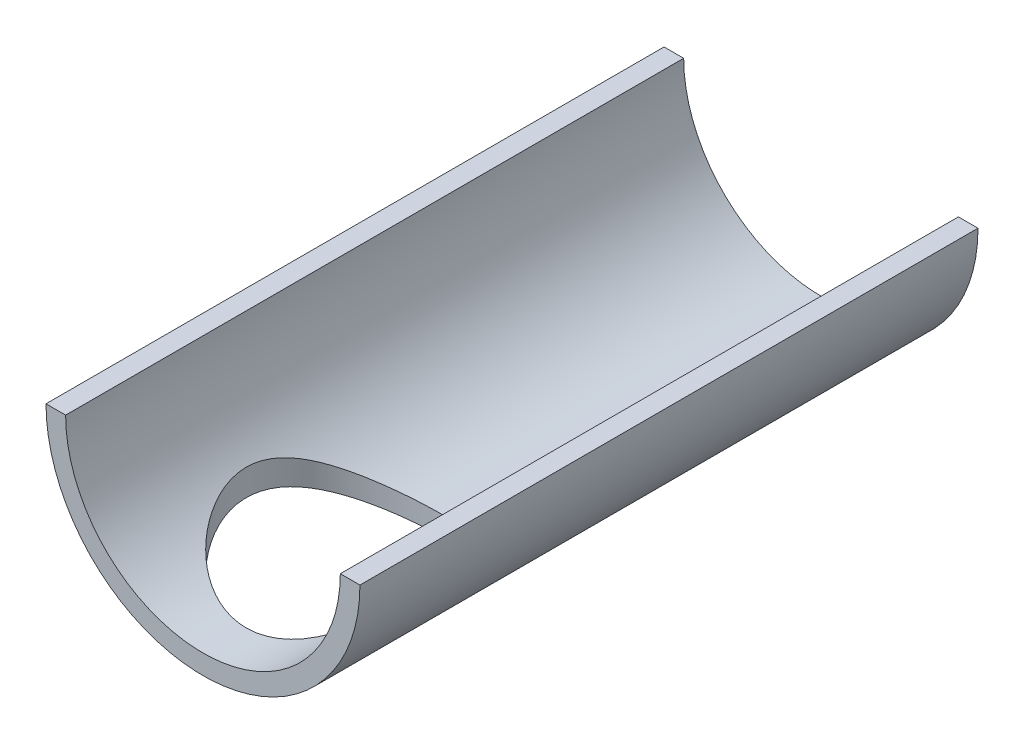
ISO-10303-21;
HEADER;
FILE_DESCRIPTION(('STEP AP214'),'2;1');
FILE_NAME('part.step','',(''),(''),'','','');
FILE_SCHEMA(('AUTOMOTIVE_DESIGN { 1 0 10303 214 1 1 1 1 }'));
ENDSEC;
DATA;
#1=APPLICATION_CONTEXT('core data for automotive mechanical design processes');
#2=APPLICATION_PROTOCOL_DEFINITION('international standard','automotive_design',2000,#1);
#3=PRODUCT_CONTEXT('',#1,'mechanical');
#4=PRODUCT('Part','Part','',(#3));
#5=PRODUCT_RELATED_PRODUCT_CATEGORY('part','',(#4));
#6=PRODUCT_DEFINITION_FORMATION('','',#4);
#7=PRODUCT_DEFINITION_CONTEXT('part definition',#1,'design');
#8=PRODUCT_DEFINITION('design','',#6,#7);
#9=PRODUCT_DEFINITION_SHAPE('','',#8);
#10=(LENGTH_UNIT() NAMED_UNIT(*) SI_UNIT(.MILLI.,.METRE.));
#11=(NAMED_UNIT(*) PLANE_ANGLE_UNIT() SI_UNIT($,.RADIAN.));
#12=(NAMED_UNIT(*) SI_UNIT($,.STERADIAN.) SOLID_ANGLE_UNIT());
#13=UNCERTAINTY_MEASURE_WITH_UNIT(LENGTH_MEASURE(1.E-05),#10,'distance_accuracy_value','');
#14=(GEOMETRIC_REPRESENTATION_CONTEXT(3) GLOBAL_UNCERTAINTY_ASSIGNED_CONTEXT((#13)) GLOBAL_UNIT_ASSIGNED_CONTEXT((#10,
#11,#12)) REPRESENTATION_CONTEXT('',''));
#15=CARTESIAN_POINT('',(0.,0.,0.));
#16=DIRECTION('',(0.,0.,1.));
#17=DIRECTION('',(1.,0.,0.));
#18=AXIS2_PLACEMENT_3D('',#15,#16,#17);
#19=CARTESIAN_POINT('',(0.,0.,0.));
#20=DIRECTION('',(0.,0.,1.));
#21=DIRECTION('',(1.,0.,0.));
#22=AXIS2_PLACEMENT_3D('',#19,#20,#21);
#23=PLANE('',#22);
#24=DIRECTION('',(1.,0.,0.));
#25=VECTOR('',#24,1.);
#26=CARTESIAN_POINT('',(-25.4,0.,0.));
#27=LINE('',#26,#25);
#28=CARTESIAN_POINT('',(22.225,0.,0.));
#29=VERTEX_POINT('',#28);
#30=CARTESIAN_POINT('',(25.4,0.,0.));
#31=VERTEX_POINT('',#30);
#32=EDGE_CURVE('E107',#29,#31,#27,.T.);
#33=ORIENTED_EDGE('',*,*,#32,.T.);
#34=CARTESIAN_POINT('',(0.,0.,0.));
#35=DIRECTION('',(0.,0.,1.));
#36=DIRECTION('',(1.,0.,0.));
#37=AXIS2_PLACEMENT_3D('',#34,#35,#36);
#38=CIRCLE('',#37,25.4);
#39=CARTESIAN_POINT('',(-25.4,0.,0.));
#40=VERTEX_POINT('',#39);
#41=EDGE_CURVE('E49',#40,#31,#38,.T.);
#42=ORIENTED_EDGE('',*,*,#41,.F.);
#43=CARTESIAN_POINT('',(-22.225,0.,0.));
#44=VERTEX_POINT('',#43);
#45=EDGE_CURVE('E108',#40,#44,#27,.T.);
#46=ORIENTED_EDGE('',*,*,#45,.T.);
#47=CARTESIAN_POINT('',(0.,0.,0.));
#48=DIRECTION('',(0.,0.,1.));
#49=DIRECTION('',(1.,0.,0.));
#50=AXIS2_PLACEMENT_3D('',#47,#48,#49);
#51=CIRCLE('',#50,22.225);
#52=EDGE_CURVE('E96',#44,#29,#51,.T.);
#53=ORIENTED_EDGE('',*,*,#52,.T.);
#54=EDGE_LOOP('',(#33,#42,#46,#53));
#55=FACE_BOUND('',#54,.T.);
#56=ADVANCED_FACE('F34',(#55),#23,.F.);
#57=CARTESIAN_POINT('',(0.,0.,914.4));
#58=DIRECTION('',(0.,0.,-1.));
#59=DIRECTION('',(-1.,0.,0.));
#60=AXIS2_PLACEMENT_3D('',#57,#58,#59);
#61=CYLINDRICAL_SURFACE('',#60,25.4);
#62=CARTESIAN_POINT('',(0.,-25.4,92.9968073449496));
#63=CARTESIAN_POINT('',(0.403478085019112,-25.3999990543276,92.9968064149674));
#64=CARTESIAN_POINT('',(0.806976901218811,-25.3903647538297,92.9814047500824));
#65=CARTESIAN_POINT('',(1.61088611196684,-25.3520626467812,92.9200121140026));
#66=CARTESIAN_POINT('',(2.01129508796472,-25.3233865694762,92.8740078506203));
#67=CARTESIAN_POINT('',(2.80641966006919,-25.2476488666224,92.7519605603984));
#68=CARTESIAN_POINT('',(3.20112462632465,-25.2005566036402,92.6758674749968));
#69=CARTESIAN_POINT('',(3.98127093758065,-25.0891361172404,92.4946884468056));
#70=CARTESIAN_POINT('',(4.36671316948776,-25.0248095512299,92.3896052919354));
#71=CARTESIAN_POINT('',(5.12399665120196,-24.8807655940299,92.1523415443632));
#72=CARTESIAN_POINT('',(5.49589617786829,-24.8011266138505,92.0202988003527));
#73=CARTESIAN_POINT('',(6.22605850684683,-24.6279718846133,91.730235050491));
#74=CARTESIAN_POINT('',(6.58432103025631,-24.5344558519347,91.5722135136751));
#75=CARTESIAN_POINT('',(7.28541967242451,-24.3354765490663,91.2317371834733));
#76=CARTESIAN_POINT('',(7.62826031997412,-24.230016818691,91.0492896264472));
#77=CARTESIAN_POINT('',(8.29732114077183,-24.0091359013327,90.6613663155604));
#78=CARTESIAN_POINT('',(8.6235392353864,-23.8937134733622,90.4558876919174));
#79=CARTESIAN_POINT('',(9.28357809411226,-23.6454901272351,90.0060142881305));
#80=CARTESIAN_POINT('',(9.61592891478028,-23.5120374030259,89.7598225958404));
#81=CARTESIAN_POINT('',(10.2588627271728,-23.2387129352431,89.2437427642791));
#82=CARTESIAN_POINT('',(10.5694447516698,-23.0988409069043,88.9738535732835));
#83=CARTESIAN_POINT('',(11.1682830854388,-22.815331073432,88.4113619417761));
#84=CARTESIAN_POINT('',(11.4565104711429,-22.6716887011865,88.1187310250183));
#85=CARTESIAN_POINT('',(12.0093097597401,-22.383780233152,87.5122112420685));
#86=CARTESIAN_POINT('',(12.2738809467561,-22.2395141186258,87.19832173306));
#87=CARTESIAN_POINT('',(12.8126705800414,-21.9340805837693,86.5062931685374));
#88=CARTESIAN_POINT('',(13.0833325208904,-21.7732739864745,86.125213443031));
#89=CARTESIAN_POINT('',(13.591387428654,-21.4598072783502,85.3382100623209));
#90=CARTESIAN_POINT('',(13.8287741644459,-21.3071486966252,84.932281774362));
#91=CARTESIAN_POINT('',(14.2680327230432,-21.0155336714143,84.0975407974568));
#92=CARTESIAN_POINT('',(14.4699524038213,-20.8765588766117,83.668759979873));
#93=CARTESIAN_POINT('',(14.7446078291284,-20.6825798979252,83.0098288344613));
#94=CARTESIAN_POINT('',(14.8314470821778,-20.6203405647611,82.7875854836434));
#95=CARTESIAN_POINT('',(14.9954622407911,-20.5013748692907,82.3380317903881));
#96=CARTESIAN_POINT('',(15.0726356766813,-20.4446499167667,82.1107201703839));
#97=CARTESIAN_POINT('',(15.2516605413133,-20.3116863970837,81.5410253173848));
#98=CARTESIAN_POINT('',(15.3475388176332,-20.2391774786352,81.1958593204899));
#99=CARTESIAN_POINT('',(15.5161970499572,-20.1101695834757,80.4970713317032));
#100=CARTESIAN_POINT('',(15.5889826102596,-20.0536667226624,80.1434514139029));
#101=CARTESIAN_POINT('',(15.7104456209953,-19.9586537842492,79.4301063006088));
#102=CARTESIAN_POINT('',(15.7591511774141,-19.9201227330864,79.0703887321092));
#103=CARTESIAN_POINT('',(15.8318333056931,-19.8624073453141,78.3468988123951));
#104=CARTESIAN_POINT('',(15.8558095387139,-19.8432232737954,77.9831264056907));
#105=CARTESIAN_POINT('',(15.8786636694612,-19.824940412479,77.2533181225699));
#106=CARTESIAN_POINT('',(15.8774750496362,-19.8258948542274,76.887278804712));
#107=CARTESIAN_POINT('',(15.8498561975666,-19.8479813363983,76.1567726603449));
#108=CARTESIAN_POINT('',(15.8234258348423,-19.8691134811233,75.7923058419741));
#109=CARTESIAN_POINT('',(15.7457362161555,-19.9307358574424,75.0674489978499));
#110=CARTESIAN_POINT('',(15.6944597792085,-19.9712394841052,74.7070619699932));
#111=CARTESIAN_POINT('',(15.5678510319425,-20.0700882007667,73.9930499690907));
#112=CARTESIAN_POINT('',(15.4925181934637,-20.1284336824833,73.6394251446903));
#113=CARTESIAN_POINT('',(15.3208164512379,-20.2594161709562,72.9490620789492));
#114=CARTESIAN_POINT('',(15.2249760993544,-20.331690232632,72.6121224045316));
#115=CARTESIAN_POINT('',(15.0122828289383,-20.4892378865461,71.9479664539986));
#116=CARTESIAN_POINT('',(14.8954230708368,-20.5745157087387,71.6207533833572));
#117=CARTESIAN_POINT('',(14.6417128690675,-20.7558315008656,70.977256965474));
#118=CARTESIAN_POINT('',(14.5048616249909,-20.8518699015904,70.6609740564756));
#119=CARTESIAN_POINT('',(14.2121049280042,-21.0524954079813,70.0401766037108));
#120=CARTESIAN_POINT('',(14.0561985545304,-21.1570829265791,69.7356626294441));
#121=CARTESIAN_POINT('',(13.6952868730199,-21.3928454802926,69.0832439324006));
#122=CARTESIAN_POINT('',(13.48655188937,-21.5253351482432,68.7378731925858));
#123=CARTESIAN_POINT('',(13.0446385731572,-21.7959752271421,68.065602947451));
#124=CARTESIAN_POINT('',(12.8114635863029,-21.9341248616975,67.7387009232654));
#125=CARTESIAN_POINT('',(12.321383488717,-22.213128710514,67.1038184870195));
#126=CARTESIAN_POINT('',(12.0644541041027,-22.3539855721747,66.795857977812));
#127=CARTESIAN_POINT('',(11.527946798228,-22.63533115601,66.200142265616));
#128=CARTESIAN_POINT('',(11.2483674153174,-22.7758198538213,65.9123883688414));
#129=CARTESIAN_POINT('',(10.6193526091659,-23.0766134134329,65.312327234173));
#130=CARTESIAN_POINT('',(10.2660075234126,-23.2363571812001,65.003818588417));
#131=CARTESIAN_POINT('',(9.53103177491885,-23.5473711335139,64.4176339269072));
#132=CARTESIAN_POINT('',(9.14939775704594,-23.6986403092069,64.1399615781969));
#133=CARTESIAN_POINT('',(8.35961107330332,-23.9886180498272,63.6178623965558));
#134=CARTESIAN_POINT('',(7.9514645255557,-24.1273294950586,63.3734279335267));
#135=CARTESIAN_POINT('',(7.11075323262921,-24.3883339160849,62.9203728710716));
#136=CARTESIAN_POINT('',(6.67819139250351,-24.5106288393742,62.7117480227261));
#137=CARTESIAN_POINT('',(5.81539896295831,-24.7290991119842,62.3432836646222));
#138=CARTESIAN_POINT('',(5.38630160040932,-24.8263276552442,62.1814194203564));
#139=CARTESIAN_POINT('',(4.51184302134852,-25.0000381870484,61.8945100244105));
#140=CARTESIAN_POINT('',(4.06648210700642,-25.0765205608251,61.7694641890512));
#141=CARTESIAN_POINT('',(3.16383825105481,-25.2063042189978,61.5583783475088));
#142=CARTESIAN_POINT('',(2.70656998579198,-25.2596327297238,61.4722925236712));
#143=CARTESIAN_POINT('',(1.78408128023092,-25.3414942463824,61.34050049));
#144=CARTESIAN_POINT('',(1.31886221218535,-25.3700314879136,61.2947873824486));
#145=CARTESIAN_POINT('',(0.454770194055508,-25.3990436445037,61.2483302394896));
#146=CARTESIAN_POINT('',(0.0563077829100022,-25.4030575433006,61.2419147090836));
#147=CARTESIAN_POINT('',(-0.739689525548352,-25.3923456877853,61.2590553303504));
#148=CARTESIAN_POINT('',(-1.13722452761715,-25.3776221639849,61.2826079146044));
#149=CARTESIAN_POINT('',(-1.9282655535054,-25.3298010656592,61.3593411455724));
#150=CARTESIAN_POINT('',(-2.32177182968895,-25.2967046492947,61.4125199247591));
#151=CARTESIAN_POINT('',(-3.10187996119,-25.2129380068548,61.5477685153375));
#152=CARTESIAN_POINT('',(-3.48848169460728,-25.1622674708289,61.6298388362827));
#153=CARTESIAN_POINT('',(-4.23713009427466,-25.0468467337469,61.8180349309017));
#154=CARTESIAN_POINT('',(-4.59954490570248,-24.9827273984638,61.9230897933132));
#155=CARTESIAN_POINT('',(-5.31352033308899,-24.8406720998749,62.1577392564772));
#156=CARTESIAN_POINT('',(-5.66508140303424,-24.7627367153839,62.2873328292112));
#157=CARTESIAN_POINT('',(-6.35565826358265,-24.5945506685743,62.5698169850426));
#158=CARTESIAN_POINT('',(-6.69467370693302,-24.5042996656931,62.7227082124016));
#159=CARTESIAN_POINT('',(-7.35877616632363,-24.3131208588343,63.0505175327164));
#160=CARTESIAN_POINT('',(-7.68386146511335,-24.212191743793,63.2254383309765));
#161=CARTESIAN_POINT('',(-8.35097887563849,-23.990764923785,63.6147501032058));
#162=CARTESIAN_POINT('',(-8.69141230854641,-23.8693202715422,63.8313426950106));
#163=CARTESIAN_POINT('',(-9.35275869086713,-23.6180242841109,64.2881376944432));
#164=CARTESIAN_POINT('',(-9.67367055620703,-23.4881724828812,64.5283414113113));
#165=CARTESIAN_POINT('',(-10.2952879502439,-23.2224333409189,65.0312056168674));
#166=CARTESIAN_POINT('',(-10.5959733532113,-23.0865402058178,65.2938878986613));
#167=CARTESIAN_POINT('',(-11.175952026542,-22.811425601633,65.8402965675688));
#168=CARTESIAN_POINT('',(-11.4552436089675,-22.6722038710632,66.1240246116898));
#169=CARTESIAN_POINT('',(-12.0305905268656,-22.3728570490359,66.7541639411494));
#170=CARTESIAN_POINT('',(-12.3231887079128,-22.2126328979492,67.1036940836236));
#171=CARTESIAN_POINT('',(-12.8779946211034,-21.8956470371712,67.8276742629193));
#172=CARTESIAN_POINT('',(-13.1401972115011,-21.7388859169093,68.2021284991075));
#173=CARTESIAN_POINT('',(-13.6324770077655,-21.433604342413,68.9743711662194));
#174=CARTESIAN_POINT('',(-13.8625779028563,-21.2850778607826,69.3721420796082));
#175=CARTESIAN_POINT('',(-14.2891116368787,-21.0011181856032,70.1900259500621));
#176=CARTESIAN_POINT('',(-14.4855379658299,-20.8656875259449,70.6101432066089));
#177=CARTESIAN_POINT('',(-14.80501175451,-20.6398034617487,71.3804830812438));
#178=CARTESIAN_POINT('',(-14.9348097948085,-20.545872845805,71.7268966173371));
#179=CARTESIAN_POINT('',(-15.1706897394332,-20.3723247903756,72.4310154250177));
#180=CARTESIAN_POINT('',(-15.2767858844427,-20.2926987620043,72.7887137681661));
#181=CARTESIAN_POINT('',(-15.464010159146,-20.1503903701908,73.5134930606595));
#182=CARTESIAN_POINT('',(-15.5451654434878,-20.0876895883088,73.8805633310443));
#183=CARTESIAN_POINT('',(-15.6815190797355,-19.9814278678433,74.6222610223455));
#184=CARTESIAN_POINT('',(-15.7367175118507,-19.937866870116,74.996888419906));
#185=CARTESIAN_POINT('',(-15.8204944089426,-19.8714583715747,75.7531778762005));
#186=CARTESIAN_POINT('',(-15.8489163785772,-19.8487326633141,76.1348681574096));
#187=CARTESIAN_POINT('',(-15.8780658880861,-19.8254226060539,76.8999883883637));
#188=CARTESIAN_POINT('',(-15.878793550085,-19.8248381594172,77.2834183304299));
#189=CARTESIAN_POINT('',(-15.8525378270945,-19.8458387824437,78.0488235004381));
#190=CARTESIAN_POINT('',(-15.8255460233412,-19.8674305873246,78.4307982510445));
#191=CARTESIAN_POINT('',(-15.74433049487,-19.9318520280648,79.1900041187305));
#192=CARTESIAN_POINT('',(-15.6901071543575,-19.9746813642871,79.5672353026593));
#193=CARTESIAN_POINT('',(-15.5607946437221,-20.0755520122944,80.2839252951086));
#194=CARTESIAN_POINT('',(-15.4877482697532,-20.1320824631934,80.6239710851288));
#195=CARTESIAN_POINT('',(-15.3202937132004,-20.2598047074532,81.2960391913376));
#196=CARTESIAN_POINT('',(-15.2258786936535,-20.3310011925997,81.628058901844));
#197=CARTESIAN_POINT('',(-15.0166498371282,-20.4860230504366,82.28261159954));
#198=CARTESIAN_POINT('',(-14.9018339119806,-20.5698497157766,82.6051436116574));
#199=CARTESIAN_POINT('',(-14.6528185436187,-20.7479735356474,83.2395494004103));
#200=CARTESIAN_POINT('',(-14.5186183829387,-20.8422710777052,83.551422782011));
#201=CARTESIAN_POINT('',(-14.0466562518148,-21.1662372883986,84.5585890540865));
#202=CARTESIAN_POINT('',(-13.6693539326506,-21.4138169833401,85.2302964232787));
#203=CARTESIAN_POINT('',(-13.037649308974,-21.8000238346084,86.1872352707655));
#204=CARTESIAN_POINT('',(-12.8159497955886,-21.9313264679229,86.4979714567282));
#205=CARTESIAN_POINT('',(-12.3512382709316,-22.1963592272427,87.1021704217589));
#206=CARTESIAN_POINT('',(-12.1082246964933,-22.3300895307212,87.3956319312652));
#207=CARTESIAN_POINT('',(-11.551456710608,-22.6239170088891,88.0207885534005));
#208=CARTESIAN_POINT('',(-11.2332311644899,-22.7839832636912,88.3485232659903));
#209=CARTESIAN_POINT('',(-10.5685366136962,-23.0998147673162,88.9763700224128));
#210=CARTESIAN_POINT('',(-10.2220639488703,-23.2555794552471,89.2764784757827));
#211=CARTESIAN_POINT('',(-9.50193867035306,-23.5589879434893,89.8473737683177));
#212=CARTESIAN_POINT('',(-9.12826701462071,-23.7066259247861,90.1181397282058));
#213=CARTESIAN_POINT('',(-8.3555459018551,-23.9898758956514,90.6279047731057));
#214=CARTESIAN_POINT('',(-7.95649853683644,-24.1254888743791,90.866906471808));
#215=CARTESIAN_POINT('',(-7.13424399250755,-24.3813095193128,91.3111312570634));
#216=CARTESIAN_POINT('',(-6.71099387158868,-24.5014884937414,91.5162916283347));
#217=CARTESIAN_POINT('',(-5.84356876084271,-24.7227225928009,91.8897210613116));
#218=CARTESIAN_POINT('',(-5.39939045466988,-24.8237746737091,92.057984252127));
#219=CARTESIAN_POINT('',(-4.49500568802871,-25.0033356886847,92.3545453532939));
#220=CARTESIAN_POINT('',(-4.03485302644359,-25.0819133522115,92.4829652136851));
#221=CARTESIAN_POINT('',(-3.10169692893334,-25.2143057415009,92.6982019823086));
#222=CARTESIAN_POINT('',(-2.62870324431315,-25.2681387301428,92.7850495750398));
#223=CARTESIAN_POINT('',(-1.79612303033696,-25.3389322210722,92.8989585930613));
#224=CARTESIAN_POINT('',(-1.4383132491834,-25.3617902143661,92.9356108185263));
#225=CARTESIAN_POINT('',(-0.720341248300809,-25.3923249957439,92.9845363640266));
#226=CARTESIAN_POINT('',(-0.360178884351765,-25.4000008441877,92.9968081751308));
#227=CARTESIAN_POINT('',(0.,-25.4,92.9968073449496));
#228=B_SPLINE_CURVE_WITH_KNOTS('',3,(#62,#63,#64,#65,#66,#67,#68,#69,#70,#71,#72,#73,#74,#75,
#76,#77,#78,#79,#80,#81,#82,#83,#84,#85,#86,#87,#88,#89,#90,#91,#92,#93,#94,#95,#96,#97,#98,#99,
#100,#101,#102,#103,#104,#105,#106,#107,#108,#109,#110,#111,#112,#113,#114,#115,#116,#117,#118,
#119,#120,#121,#122,#123,#124,#125,#126,#127,#128,#129,#130,#131,#132,#133,#134,#135,#136,#137,
#138,#139,#140,#141,#142,#143,#144,#145,#146,#147,#148,#149,#150,#151,#152,#153,#154,#155,#156,
#157,#158,#159,#160,#161,#162,#163,#164,#165,#166,#167,#168,#169,#170,#171,#172,#173,#174,#175,
#176,#177,#178,#179,#180,#181,#182,#183,#184,#185,#186,#187,#188,#189,#190,#191,#192,#193,#194,
#195,#196,#197,#198,#199,#200,#201,#202,#203,#204,#205,#206,#207,#208,#209,#210,#211,#212,#213,
#214,#215,#216,#217,#218,#219,#220,#221,#222,#223,#224,#225,#226,#227),.UNSPECIFIED.,.T.,.F.,(4,
2,2,2,2,2,2,2,2,2,2,2,2,2,2,2,2,2,2,2,2,2,2,2,2,2,2,2,2,2,2,2,2,2,2,2,2,2,2,2,2,2,2,2,2,2,2,2,2,
2,2,2,2,2,2,2,2,2,2,2,2,2,2,2,2,2,2,2,2,2,2,2,2,2,2,2,2,2,2,2,2,2,4),(0.,1.21006493393103,
2.42065580102828,3.63326925125319,4.84576612738783,6.05221195934292,7.25868245217372,
8.46479630832869,9.6710606195256,10.9735649227531,12.27612706199,13.5803473417056,
14.8846070760038,16.3657225005488,17.8471149096481,19.3264927626546,20.0660080620244,
20.8057119281486,21.9010393246928,22.9961006960052,24.0898808851711,25.1836760610353,
26.2803627951922,27.3770551983714,28.4745070455893,29.5719829890864,30.6439989222017,
31.7163643149969,32.7887726543756,33.8612328228759,35.1342354935968,36.4070641239586,
37.6812081055037,38.9554343757409,40.4401935576437,41.9251291180267,43.4097232186271,
44.8941410456778,46.2984751244036,47.7027831244746,49.105435314793,50.507847814238,
51.7019276850319,52.8958654252829,54.0897279125609,55.2836114567749,56.4306233171826,
57.5775871355951,58.7245826773286,59.8717192115154,61.1345777843243,62.397506422374,
63.6616736588416,64.9259405335383,66.3738366318764,67.8219773013237,69.2690436079065,
70.7163893472354,71.8603395415966,73.0036005628323,74.1456123993311,75.2876207068769,
76.4362628280201,77.5848998839521,78.7338858991685,79.8828557039791,80.938878926872,
81.995240506448,83.0517102740475,84.1082191546189,86.525635671508,87.7359874136102,
88.9464279968879,90.3969356329842,91.8476315197825,93.2993529942888,94.7509549412965,
96.2052175099159,97.6597113057075,99.1097083273275,100.558633449264,101.63877356585,
102.718980531429),.UNSPECIFIED.);
#229=CARTESIAN_POINT('',(0.,-25.4,92.9968073449496));
#230=VERTEX_POINT('',#229);
#231=EDGE_CURVE('E116',#230,#230,#228,.T.);
#232=ORIENTED_EDGE('',*,*,#231,.T.);
#233=EDGE_LOOP('',(#232));
#234=FACE_BOUND('',#233,.T.);
#235=DIRECTION('',(0.,0.,-1.));
#236=VECTOR('',#235,1.);
#237=CARTESIAN_POINT('',(25.4,0.,100.0125));
#238=LINE('',#237,#236);
#239=CARTESIAN_POINT('',(25.4,0.,100.0125));
#240=VERTEX_POINT('',#239);
#241=EDGE_CURVE('E80',#240,#31,#238,.T.);
#242=ORIENTED_EDGE('',*,*,#241,.F.);
#243=CARTESIAN_POINT('',(0.,0.,100.0125));
#244=DIRECTION('',(0.,0.,-1.));
#245=DIRECTION('',(-1.,0.,0.));
#246=AXIS2_PLACEMENT_3D('',#243,#244,#245);
#247=CIRCLE('',#246,25.4);
#248=CARTESIAN_POINT('',(-25.4,0.,100.0125));
#249=VERTEX_POINT('',#248);
#250=EDGE_CURVE('E89',#240,#249,#247,.T.);
#251=ORIENTED_EDGE('',*,*,#250,.T.);
#252=DIRECTION('',(0.,0.,-1.));
#253=VECTOR('',#252,1.);
#254=CARTESIAN_POINT('',(-25.4,0.,100.0125));
#255=LINE('',#254,#253);
#256=EDGE_CURVE('E56',#249,#40,#255,.T.);
#257=ORIENTED_EDGE('',*,*,#256,.T.);
#258=ORIENTED_EDGE('',*,*,#41,.T.);
#259=EDGE_LOOP('',(#242,#251,#257,#258));
#260=FACE_BOUND('',#259,.T.);
#261=ADVANCED_FACE('F36',(#234,#260),#61,.T.);
#262=CARTESIAN_POINT('',(0.,0.,914.4));
#263=DIRECTION('',(0.,0.,-1.));
#264=DIRECTION('',(-1.,0.,0.));
#265=AXIS2_PLACEMENT_3D('',#262,#263,#264);
#266=CYLINDRICAL_SURFACE('',#265,22.225);
#267=CARTESIAN_POINT('',(0.,-22.225,92.9968073449496));
#268=CARTESIAN_POINT('',(0.392850681906904,-22.2250006660962,92.9968080609966));
#269=CARTESIAN_POINT('',(0.785692872025161,-22.2145626330166,92.9822048277967));
#270=CARTESIAN_POINT('',(1.56811207361683,-22.1730719320079,92.9240392898383));
#271=CARTESIAN_POINT('',(1.95768918035417,-22.1420198676606,92.8804778329808));
#272=CARTESIAN_POINT('',(2.73063278288182,-22.0600404614185,92.7650816576299));
#273=CARTESIAN_POINT('',(3.11399701259986,-22.009106030354,92.6932368544725));
#274=CARTESIAN_POINT('',(3.87159824590775,-21.8885471971897,92.5223645150918));
#275=CARTESIAN_POINT('',(4.24583505511336,-21.8189223974246,92.4233364005023));
#276=CARTESIAN_POINT('',(4.98090366436842,-21.6629105451479,92.2000379370465));
#277=CARTESIAN_POINT('',(5.34179415650251,-21.5766109012349,92.0758990648245));
#278=CARTESIAN_POINT('',(6.05024638237031,-21.3887694922934,91.803570806942));
#279=CARTESIAN_POINT('',(6.3978082084069,-21.287227832842,91.6553815878707));
#280=CARTESIAN_POINT('',(7.0780745734286,-21.0708066264357,91.3365040633934));
#281=CARTESIAN_POINT('',(7.41078006668976,-20.9559279378778,91.1658172058834));
#282=CARTESIAN_POINT('',(8.06025371054026,-20.7148005639484,90.8034104415841));
#283=CARTESIAN_POINT('',(8.37701961456368,-20.5885502827932,90.6116875819713));
#284=CARTESIAN_POINT('',(9.02134941690293,-20.314996664453,90.1905480058734));
#285=CARTESIAN_POINT('',(9.34734079672669,-20.1668204278987,89.9592933224098));
#286=CARTESIAN_POINT('',(9.97855786068069,-19.8620709018169,89.4750367421438));
#287=CARTESIAN_POINT('',(10.2837825367504,-19.7054972053173,89.2220337909809));
#288=CARTESIAN_POINT('',(10.8732786856315,-19.3864618222875,88.695221530319));
#289=CARTESIAN_POINT('',(11.1575206722389,-19.2239923111348,88.4213839995389));
#290=CARTESIAN_POINT('',(11.7040902282054,-18.8962024291983,87.8542357520978));
#291=CARTESIAN_POINT('',(11.9664163708978,-18.7308818736622,87.5609237699256));
#292=CARTESIAN_POINT('',(12.5148717383741,-18.3699546547412,86.8998687881391));
#293=CARTESIAN_POINT('',(12.7964983959181,-18.1743728688998,86.5283613219391));
#294=CARTESIAN_POINT('',(13.3272973305481,-17.7887999179959,85.7599145414577));
#295=CARTESIAN_POINT('',(13.5764607590403,-17.5988102880814,85.3629683370705));
#296=CARTESIAN_POINT('',(14.0404660664344,-17.230887569845,84.5448684208052));
#297=CARTESIAN_POINT('',(14.2553494752828,-17.0529400455192,84.1237448541922));
#298=CARTESIAN_POINT('',(14.6489550403686,-16.7160350719173,83.2577418360541));
#299=CARTESIAN_POINT('',(14.8276968200672,-16.5570673366803,82.8128754426891));
#300=CARTESIAN_POINT('',(15.0950897999953,-16.3128899373892,82.0473947548552));
#301=CARTESIAN_POINT('',(15.194240780601,-16.2203859212937,81.7327452438703));
#302=CARTESIAN_POINT('',(15.3735580348154,-16.0505324975159,81.0941191579811));
#303=CARTESIAN_POINT('',(15.4537301270175,-15.9731784463799,80.7701454759562));
#304=CARTESIAN_POINT('',(15.5939119992639,-15.8363550038485,80.1147355703406));
#305=CARTESIAN_POINT('',(15.6539571182204,-15.7768542850679,79.7833135283329));
#306=CARTESIAN_POINT('',(15.7530851812215,-15.6778781733738,79.1143525151395));
#307=CARTESIAN_POINT('',(15.792168136661,-15.6384027695746,78.7768135472791));
#308=CARTESIAN_POINT('',(15.8487982360251,-15.5810102195983,78.0958222067346));
#309=CARTESIAN_POINT('',(15.8662014844526,-15.5632371342288,77.7523455050306));
#310=CARTESIAN_POINT('',(15.8786221117563,-15.5505648670745,77.0645708906655));
#311=CARTESIAN_POINT('',(15.8736401831501,-15.5556649776747,76.7202730037384));
#312=CARTESIAN_POINT('',(15.8413894200475,-15.5885061824724,76.0335774978133));
#313=CARTESIAN_POINT('',(15.8141047452529,-15.6162633686072,75.6911814036152));
#314=CARTESIAN_POINT('',(15.7377981726822,-15.6931588920821,75.0112580196825));
#315=CARTESIAN_POINT('',(15.6887738106727,-15.742299653278,74.6737312863785));
#316=CARTESIAN_POINT('',(15.5622878983037,-15.8674101628234,73.9631448598438));
#317=CARTESIAN_POINT('',(15.4819938672747,-15.9460050742962,73.5910533660097));
#318=CARTESIAN_POINT('',(15.2964435476861,-16.1240789651255,72.8583140657));
#319=CARTESIAN_POINT('',(15.1911834373383,-16.2235611416205,72.4976680208776));
#320=CARTESIAN_POINT('',(14.9570442074699,-16.4396730805242,71.788694517569));
#321=CARTESIAN_POINT('',(14.8281222403798,-16.5563338734528,71.4403907965316));
#322=CARTESIAN_POINT('',(14.5481769977467,-16.8028559110631,70.7576627574527));
#323=CARTESIAN_POINT('',(14.3971517864341,-16.9327183116176,70.4232396583518));
#324=CARTESIAN_POINT('',(14.0240556789867,-17.2439063598631,69.6672736712814));
#325=CARTESIAN_POINT('',(13.7944730541936,-17.4287072383334,69.2508559109847));
#326=CARTESIAN_POINT('',(13.3012559409508,-17.8079777688461,68.4433185988911));
#327=CARTESIAN_POINT('',(13.0376118123711,-18.0024501485085,68.0522062562773));
#328=CARTESIAN_POINT('',(12.4774161867444,-18.3951575516152,67.2957516230923));
#329=CARTESIAN_POINT('',(12.1808377939751,-18.5933955390959,66.9304307992977));
#330=CARTESIAN_POINT('',(11.5559702432215,-18.9880685650995,66.2270167611605));
#331=CARTESIAN_POINT('',(11.2276843270826,-19.1845037856973,65.8889207697602));
#332=CARTESIAN_POINT('',(10.5367715726995,-19.5725726576967,65.2382283476479));
#333=CARTESIAN_POINT('',(10.1738348311204,-19.7641388625929,64.9259199358777));
#334=CARTESIAN_POINT('',(9.41740545811419,-20.1355579275471,64.3327832285591));
#335=CARTESIAN_POINT('',(9.02390979506756,-20.3154096221961,64.051958063099));
#336=CARTESIAN_POINT('',(8.20844840883031,-20.6583421234397,63.5250420632104));
#337=CARTESIAN_POINT('',(7.78653926860955,-20.8214547190524,63.278885046812));
#338=CARTESIAN_POINT('',(7.1337114351518,-21.0502738121674,62.9377989485122));
#339=CARTESIAN_POINT('',(6.91279567194732,-21.1238992714753,62.8288037329392));
#340=CARTESIAN_POINT('',(6.46452849455527,-21.2653646775588,62.620545935184));
#341=CARTESIAN_POINT('',(6.23717548929705,-21.3332031770687,62.5212857867292));
#342=CARTESIAN_POINT('',(5.66402989788315,-21.4940942324149,62.2870009394358));
#343=CARTESIAN_POINT('',(5.31458762718837,-21.583293508146,62.1581649383589));
#344=CARTESIAN_POINT('',(4.60425302296492,-21.7459010396656,61.9245628255567));
#345=CARTESIAN_POINT('',(4.24336316929811,-21.8193126890417,61.8197915407333));
#346=CARTESIAN_POINT('',(3.51229800918464,-21.9488517666274,61.6356400298843));
#347=CARTESIAN_POINT('',(3.14212767718898,-22.0049882490291,61.5562465021216));
#348=CARTESIAN_POINT('',(2.39475851098459,-22.0988142099316,61.4238848351664));
#349=CARTESIAN_POINT('',(2.01755948005372,-22.1365031713081,61.3709174367552));
#350=CARTESIAN_POINT('',(1.25767603284775,-22.1926670638027,61.292080828549));
#351=CARTESIAN_POINT('',(0.874977896844854,-22.2110799400903,61.266299134832));
#352=CARTESIAN_POINT('',(0.108276877653793,-22.2280437016789,61.2425442458479));
#353=CARTESIAN_POINT('',(-0.275726002714484,-22.2265946298793,61.2445709905179));
#354=CARTESIAN_POINT('',(-1.0420184300262,-22.203868451535,61.2764011609651));
#355=CARTESIAN_POINT('',(-1.42430781379149,-22.1825894952534,61.3062071780003));
#356=CARTESIAN_POINT('',(-2.18416888869125,-22.1206992753082,61.393130758616));
#357=CARTESIAN_POINT('',(-2.56174066659692,-22.080088367757,61.4502478191018));
#358=CARTESIAN_POINT('',(-3.29155266084324,-21.9828413786664,61.5875695834123));
#359=CARTESIAN_POINT('',(-3.64414133861019,-21.9270635273382,61.6665410012279));
#360=CARTESIAN_POINT('',(-4.34046273486669,-21.7999143900716,61.8474691062876));
#361=CARTESIAN_POINT('',(-4.684195804933,-21.7285437242538,61.9494248794572));
#362=CARTESIAN_POINT('',(-5.36105754202539,-21.571518460512,62.1751694875373));
#363=CARTESIAN_POINT('',(-5.69418567709312,-21.4858631473903,62.2989594156488));
#364=CARTESIAN_POINT('',(-6.34840651031988,-21.301734044044,62.567138813268));
#365=CARTESIAN_POINT('',(-6.66949763734799,-21.2032585879209,62.7115309601413));
#366=CARTESIAN_POINT('',(-7.32701099853534,-20.9856161057643,63.0336406893098));
#367=CARTESIAN_POINT('',(-7.66218067328956,-20.8653823539317,63.2131933199824));
#368=CARTESIAN_POINT('',(-8.31566471677316,-20.6136600252535,63.5937496203308));
#369=CARTESIAN_POINT('',(-8.63397824532308,-20.4821708882466,63.7947543577645));
#370=CARTESIAN_POINT('',(-9.25310799099117,-20.2100230317495,64.2169209064633));
#371=CARTESIAN_POINT('',(-9.55391360121081,-20.0693588609113,64.438094732837));
#372=CARTESIAN_POINT('',(-10.1372329778513,-19.7811272892801,64.8992708133835));
#373=CARTESIAN_POINT('',(-10.4197449849856,-19.633559226887,65.1392748735562));
#374=CARTESIAN_POINT('',(-11.0154565453373,-19.3066231462665,65.6821470375924));
#375=CARTESIAN_POINT('',(-11.3249545405923,-19.1263340029844,65.9885305496491));
#376=CARTESIAN_POINT('',(-11.9171209802587,-18.7630896597592,66.6248177179776));
#377=CARTESIAN_POINT('',(-12.1997848925027,-18.5801340154528,66.9547253309559));
#378=CARTESIAN_POINT('',(-12.7376704130936,-18.2155970263292,67.6372781539296));
#379=CARTESIAN_POINT('',(-12.9928764012401,-18.0340165178228,67.9899361255448));
#380=CARTESIAN_POINT('',(-13.4746918121133,-17.6769108420435,68.7171357783897));
#381=CARTESIAN_POINT('',(-13.7013062731146,-17.5013846118843,69.0916735869838));
#382=CARTESIAN_POINT('',(-14.0918072154378,-17.1879091560964,69.8023483224607));
#383=CARTESIAN_POINT('',(-14.2599711523699,-17.0483546752914,70.135429139877));
#384=CARTESIAN_POINT('',(-14.573925767921,-16.7807583547868,70.8165006157602));
#385=CARTESIAN_POINT('',(-14.7197166473304,-16.6527164117704,71.1644911403817));
#386=CARTESIAN_POINT('',(-14.9873483917696,-16.4122618399832,71.8740895364862));
#387=CARTESIAN_POINT('',(-15.1092306034929,-16.299822329339,72.2356725874159));
#388=CARTESIAN_POINT('',(-15.3277654278366,-16.0944946502693,72.9718050605148));
#389=CARTESIAN_POINT('',(-15.4244241305872,-16.0016017634288,73.3463513279769));
#390=CARTESIAN_POINT('',(-15.575342064756,-15.854598015009,74.0356139905848));
#391=CARTESIAN_POINT('',(-15.6341448862423,-15.7964865721826,74.3484849213168));
#392=CARTESIAN_POINT('',(-15.7330869753834,-15.6979457190058,74.9799222092952));
#393=CARTESIAN_POINT('',(-15.7732285591909,-15.6575141143466,75.2984878546386));
#394=CARTESIAN_POINT('',(-15.8341420083332,-15.5959117103407,75.9390287134916));
#395=CARTESIAN_POINT('',(-15.8549321532848,-15.5747227346219,76.2610004181683));
#396=CARTESIAN_POINT('',(-15.8768200034572,-15.5524102065051,76.9063219959375));
#397=CARTESIAN_POINT('',(-15.8779174127033,-15.5512869556878,77.2296718896707));
#398=CARTESIAN_POINT('',(-15.8603969562493,-15.5691548955657,77.8752795624011));
#399=CARTESIAN_POINT('',(-15.8417785953162,-15.588146591521,78.1975373137613));
#400=CARTESIAN_POINT('',(-15.7851781207633,-15.6454588508231,78.8385867994806));
#401=CARTESIAN_POINT('',(-15.7471960742462,-15.6837793471881,79.1573785458468));
#402=CARTESIAN_POINT('',(-15.6524605855232,-15.7783258208176,79.7898583487442));
#403=CARTESIAN_POINT('',(-15.5956834790501,-15.8345743673894,80.1035394455416));
#404=CARTESIAN_POINT('',(-15.4642052728552,-15.9630011809052,80.7238287898684));
#405=CARTESIAN_POINT('',(-15.3894996266833,-16.0351834880759,81.0304352216999));
#406=CARTESIAN_POINT('',(-15.1948698762086,-16.2200540321065,81.7378564424612));
#407=CARTESIAN_POINT('',(-15.068200417274,-16.3381809183742,82.1354047778977));
#408=CARTESIAN_POINT('',(-14.7864326900206,-16.5936180303841,82.9139205378283));
#409=CARTESIAN_POINT('',(-14.6313243715577,-16.7309350337209,83.2948820415404));
#410=CARTESIAN_POINT('',(-14.2942564474527,-17.0198171702739,84.0396942077433));
#411=CARTESIAN_POINT('',(-14.1122630172721,-17.1714001632556,84.4035225430667));
#412=CARTESIAN_POINT('',(-13.7229790973841,-17.4840726577133,85.1130026886927));
#413=CARTESIAN_POINT('',(-13.5156905171507,-17.6451614411451,85.4586558681819));
#414=CARTESIAN_POINT('',(-13.0709356659282,-17.9772172329408,86.1404745043449));
#415=CARTESIAN_POINT('',(-12.8328081238372,-18.1483333673427,86.4761353794928));
#416=CARTESIAN_POINT('',(-12.3317774057622,-18.4924381191836,87.1273898247808));
#417=CARTESIAN_POINT('',(-12.0688741975643,-18.665426739057,87.4429833688279));
#418=CARTESIAN_POINT('',(-11.5188286592269,-19.0098008508183,88.0534611078208));
#419=CARTESIAN_POINT('',(-11.2316786637552,-19.1811858165656,88.3483386992843));
#420=CARTESIAN_POINT('',(-10.6337612854009,-19.5190084444272,88.9162454713341));
#421=CARTESIAN_POINT('',(-10.3229915474972,-19.6854456109106,89.1892724677069));
#422=CARTESIAN_POINT('',(-9.62311784999381,-20.0380868852902,89.7569793102221));
#423=CARTESIAN_POINT('',(-9.22972190979794,-20.2227832223903,90.04733744062));
#424=CARTESIAN_POINT('',(-8.41264032362546,-20.5761083658225,90.5934277548704));
#425=CARTESIAN_POINT('',(-7.98894966044846,-20.7447344998819,90.8491541828726));
#426=CARTESIAN_POINT('',(-7.11393445321899,-21.0608320180743,91.322321004454));
#427=CARTESIAN_POINT('',(-6.66264718314002,-21.2083310751658,91.539811567211));
#428=CARTESIAN_POINT('',(-5.73504769620166,-21.4777282636985,91.9332345551459));
#429=CARTESIAN_POINT('',(-5.25874527437064,-21.5996363235802,92.1091831005369));
#430=CARTESIAN_POINT('',(-4.39202388403096,-21.7901893385649,92.3823666865034));
#431=CARTESIAN_POINT('',(-4.00563445275707,-21.8646520872757,92.4884012364391));
#432=CARTESIAN_POINT('',(-3.22278489090329,-21.9936704276795,92.671430133715));
#433=CARTESIAN_POINT('',(-2.82632636318415,-22.0482291668326,92.7484290725782));
#434=CARTESIAN_POINT('',(-2.02669491625937,-22.1360518016912,92.8720988597973));
#435=CARTESIAN_POINT('',(-1.62352764809901,-22.1693327727909,92.9187940273635));
#436=CARTESIAN_POINT('',(-0.813570547475888,-22.2138065076323,92.9811478718839));
#437=CARTESIAN_POINT('',(-0.406780721395934,-22.2249993102848,92.9968066035123));
#438=CARTESIAN_POINT('',(0.,-22.225,92.9968073449496));
#439=B_SPLINE_CURVE_WITH_KNOTS('',3,(#267,#268,#269,#270,#271,#272,#273,#274,#275,#276,#277,
#278,#279,#280,#281,#282,#283,#284,#285,#286,#287,#288,#289,#290,#291,#292,#293,#294,#295,#296,
#297,#298,#299,#300,#301,#302,#303,#304,#305,#306,#307,#308,#309,#310,#311,#312,#313,#314,#315,
#316,#317,#318,#319,#320,#321,#322,#323,#324,#325,#326,#327,#328,#329,#330,#331,#332,#333,#334,
#335,#336,#337,#338,#339,#340,#341,#342,#343,#344,#345,#346,#347,#348,#349,#350,#351,#352,#353,
#354,#355,#356,#357,#358,#359,#360,#361,#362,#363,#364,#365,#366,#367,#368,#369,#370,#371,#372,
#373,#374,#375,#376,#377,#378,#379,#380,#381,#382,#383,#384,#385,#386,#387,#388,#389,#390,#391,
#392,#393,#394,#395,#396,#397,#398,#399,#400,#401,#402,#403,#404,#405,#406,#407,#408,#409,#410,
#411,#412,#413,#414,#415,#416,#417,#418,#419,#420,#421,#422,#423,#424,#425,#426,#427,#428,#429,
#430,#431,#432,#433,#434,#435,#436,#437,#438),.UNSPECIFIED.,.T.,.F.,(4,2,2,2,2,2,2,2,2,2,2,2,2,
2,2,2,2,2,2,2,2,2,2,2,2,2,2,2,2,2,2,2,2,2,2,2,2,2,2,2,2,2,2,2,2,2,2,2,2,2,2,2,2,2,2,2,2,2,2,2,2,
2,2,2,2,2,2,2,2,2,2,2,2,2,2,2,2,2,2,2,2,2,2,2,2,4),(0.,1.17813145847064,2.35622842259733,
3.53474582807175,4.71328831023865,5.8858127948886,7.05832915817469,8.23077009782892,
9.40337582406044,10.6809697290971,11.9586256071096,13.2380440355205,14.5175456860954,
16.0324935911347,17.5478535697362,19.0613635276514,20.5740494902836,21.6010673763819,
22.6277699878989,23.6526603564379,24.6775501678509,25.7092068866606,26.7408316899159,
27.7731898314641,28.8056650226252,29.9700201358555,31.1345536028324,32.3012170276911,
33.467982688425,34.9963894304239,36.5252296955511,38.055327797534,39.5852696242672,
41.1304735725986,42.6758310102945,44.2181971474131,44.9892408530349,45.760476827743,
46.9081212531228,48.0555187424912,49.2023138341667,50.3491410711745,51.4996490013065,
52.6501544464755,53.8007672218438,54.9513588026786,56.0469846202689,57.1425668731434,
58.2382039956362,59.33398363178,60.5291922902331,61.7244604668212,62.9204453977719,
64.116545175692,65.5291495056087,66.9419919957529,68.3556340175176,69.7690265844756,
70.9631619751734,72.1572866482943,73.3493276831135,74.5410806368237,75.5109276532633,
76.4806542642878,77.4494639267539,78.4182881500712,79.3871367095044,80.3559819115196,
81.326051625276,82.2963675968241,83.5953436303318,84.8947796030728,86.1958645618075,
87.4968513652552,88.83279966576,90.1687497033224,91.5051236782091,92.8416310723279,
94.4074393327398,95.9735075147093,97.5375052725422,99.1008951261658,100.321978111725,
101.542867921253,102.762776733654,103.982683397045),.UNSPECIFIED.);
#440=CARTESIAN_POINT('',(0.,-22.225,92.9968073449496));
#441=VERTEX_POINT('',#440);
#442=EDGE_CURVE('E39',#441,#441,#439,.T.);
#443=ORIENTED_EDGE('',*,*,#442,.F.);
#444=EDGE_LOOP('',(#443));
#445=FACE_BOUND('',#444,.T.);
#446=CARTESIAN_POINT('',(0.,0.,100.0125));
#447=DIRECTION('',(0.,0.,-1.));
#448=DIRECTION('',(-1.,0.,0.));
#449=AXIS2_PLACEMENT_3D('',#446,#447,#448);
#450=CIRCLE('',#449,22.225);
#451=CARTESIAN_POINT('',(22.225,0.,100.0125));
#452=VERTEX_POINT('',#451);
#453=CARTESIAN_POINT('',(-22.225,0.,100.0125));
#454=VERTEX_POINT('',#453);
#455=EDGE_CURVE('E94',#452,#454,#450,.T.);
#456=ORIENTED_EDGE('',*,*,#455,.F.);
#457=DIRECTION('',(0.,0.,-1.));
#458=VECTOR('',#457,1.);
#459=CARTESIAN_POINT('',(22.225,0.,914.4));
#460=LINE('',#459,#458);
#461=EDGE_CURVE('E63',#452,#29,#460,.T.);
#462=ORIENTED_EDGE('',*,*,#461,.T.);
#463=ORIENTED_EDGE('',*,*,#52,.F.);
#464=DIRECTION('',(0.,0.,-1.));
#465=VECTOR('',#464,1.);
#466=CARTESIAN_POINT('',(-22.225,0.,914.4));
#467=LINE('',#466,#465);
#468=EDGE_CURVE('E98',#44,#454,#467,.F.);
#469=ORIENTED_EDGE('',*,*,#468,.T.);
#470=EDGE_LOOP('',(#456,#462,#463,#469));
#471=FACE_BOUND('',#470,.T.);
#472=ADVANCED_FACE('F111',(#445,#471),#266,.F.);
#473=CARTESIAN_POINT('',(0.,0.,100.0125));
#474=DIRECTION('',(0.,0.,-1.));
#475=DIRECTION('',(-1.,0.,0.));
#476=AXIS2_PLACEMENT_3D('',#473,#474,#475);
#477=PLANE('',#476);
#478=DIRECTION('',(1.,0.,0.));
#479=VECTOR('',#478,1.);
#480=CARTESIAN_POINT('',(-25.4,0.,100.0125));
#481=LINE('',#480,#479);
#482=EDGE_CURVE('E91',#249,#454,#481,.T.);
#483=ORIENTED_EDGE('',*,*,#482,.F.);
#484=ORIENTED_EDGE('',*,*,#250,.F.);
#485=DIRECTION('',(1.,0.,0.));
#486=VECTOR('',#485,1.);
#487=CARTESIAN_POINT('',(0.,0.,100.0125));
#488=LINE('',#487,#486);
#489=EDGE_CURVE('E11',#452,#240,#488,.T.);
#490=ORIENTED_EDGE('',*,*,#489,.F.);
#491=ORIENTED_EDGE('',*,*,#455,.T.);
#492=EDGE_LOOP('',(#483,#484,#490,#491));
#493=FACE_BOUND('',#492,.T.);
#494=ADVANCED_FACE('F93',(#493),#477,.F.);
#495=CARTESIAN_POINT('',(-25.4,0.,100.0125));
#496=DIRECTION('',(0.,1.,0.));
#497=DIRECTION('',(0.,0.,1.));
#498=AXIS2_PLACEMENT_3D('',#495,#496,#497);
#499=PLANE('',#498);
#500=ORIENTED_EDGE('',*,*,#489,.T.);
#501=ORIENTED_EDGE('',*,*,#241,.T.);
#502=ORIENTED_EDGE('',*,*,#32,.F.);
#503=ORIENTED_EDGE('',*,*,#461,.F.);
#504=EDGE_LOOP('',(#500,#501,#502,#503));
#505=FACE_BOUND('',#504,.T.);
#506=ADVANCED_FACE('F79',(#505),#499,.T.);
#507=ORIENTED_EDGE('',*,*,#45,.F.);
#508=ORIENTED_EDGE('',*,*,#256,.F.);
#509=ORIENTED_EDGE('',*,*,#482,.T.);
#510=ORIENTED_EDGE('',*,*,#468,.F.);
#511=EDGE_LOOP('',(#507,#508,#509,#510));
#512=FACE_BOUND('',#511,.T.);
#513=ADVANCED_FACE('F125',(#512),#499,.T.);
#514=CARTESIAN_POINT('',(0.,-25.4,77.1218073449496));
#515=DIRECTION('',(0.,1.,0.));
#516=DIRECTION('',(0.,0.,1.));
#517=AXIS2_PLACEMENT_3D('',#514,#515,#516);
#518=CYLINDRICAL_SURFACE('',#517,15.875);
#519=ORIENTED_EDGE('',*,*,#442,.T.);
#520=EDGE_LOOP('',(#519));
#521=FACE_BOUND('',#520,.T.);
#522=ORIENTED_EDGE('',*,*,#231,.F.);
#523=EDGE_LOOP('',(#522));
#524=FACE_BOUND('',#523,.T.);
#525=ADVANCED_FACE('F121',(#521,#524),#518,.F.);
#526=CLOSED_SHELL('',(#56,#261,#472,#494,#506,#513,#525));
#527=MANIFOLD_SOLID_BREP('B2',#526);
#528=ADVANCED_BREP_SHAPE_REPRESENTATION('',(#18,#527),#14);
#529=SHAPE_DEFINITION_REPRESENTATION(#9,#528);
ENDSEC;
END-ISO-10303-21;
